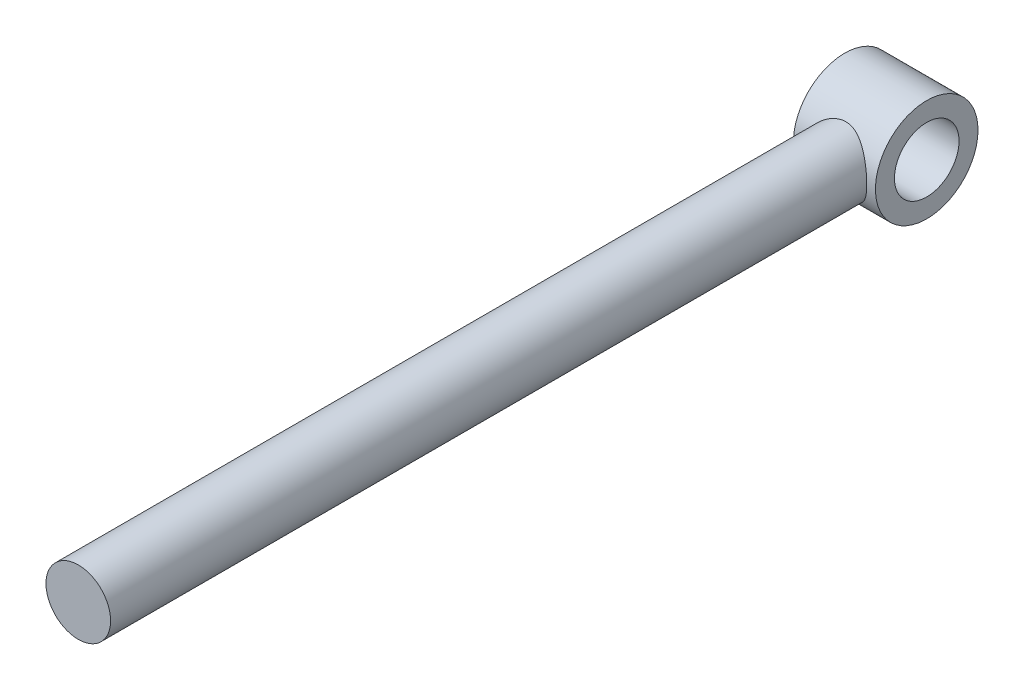
ISO-10303-21;
HEADER;
FILE_DESCRIPTION(('STEP AP214'),'2;1');
FILE_NAME('part.step','',(''),(''),'','','');
FILE_SCHEMA(('AUTOMOTIVE_DESIGN { 1 0 10303 214 1 1 1 1 }'));
ENDSEC;
DATA;
#1=APPLICATION_CONTEXT('core data for automotive mechanical design processes');
#2=APPLICATION_PROTOCOL_DEFINITION('international standard','automotive_design',2000,#1);
#3=PRODUCT_CONTEXT('',#1,'mechanical');
#4=PRODUCT('Part','Part','',(#3));
#5=PRODUCT_RELATED_PRODUCT_CATEGORY('part','',(#4));
#6=PRODUCT_DEFINITION_FORMATION('','',#4);
#7=PRODUCT_DEFINITION_CONTEXT('part definition',#1,'design');
#8=PRODUCT_DEFINITION('design','',#6,#7);
#9=PRODUCT_DEFINITION_SHAPE('','',#8);
#10=(LENGTH_UNIT() NAMED_UNIT(*) SI_UNIT(.MILLI.,.METRE.));
#11=(NAMED_UNIT(*) PLANE_ANGLE_UNIT() SI_UNIT($,.RADIAN.));
#12=(NAMED_UNIT(*) SI_UNIT($,.STERADIAN.) SOLID_ANGLE_UNIT());
#13=UNCERTAINTY_MEASURE_WITH_UNIT(LENGTH_MEASURE(1.E-05),#10,'distance_accuracy_value','');
#14=(GEOMETRIC_REPRESENTATION_CONTEXT(3) GLOBAL_UNCERTAINTY_ASSIGNED_CONTEXT((#13)) GLOBAL_UNIT_ASSIGNED_CONTEXT((#10,
#11,#12)) REPRESENTATION_CONTEXT('',''));
#15=CARTESIAN_POINT('',(0.,0.,0.));
#16=DIRECTION('',(0.,0.,1.));
#17=DIRECTION('',(1.,0.,0.));
#18=AXIS2_PLACEMENT_3D('',#15,#16,#17);
#19=CARTESIAN_POINT('',(0.,0.,100.));
#20=DIRECTION('',(0.,0.,-1.));
#21=DIRECTION('',(-1.,0.,0.));
#22=AXIS2_PLACEMENT_3D('',#19,#20,#21);
#23=CYLINDRICAL_SURFACE('',#22,4.);
#24=CARTESIAN_POINT('',(0.,0.,100.));
#25=DIRECTION('',(0.,0.,1.));
#26=DIRECTION('',(1.,0.,0.));
#27=AXIS2_PLACEMENT_3D('',#24,#25,#26);
#28=CIRCLE('',#27,4.);
#29=CARTESIAN_POINT('',(4.,0.,100.));
#30=VERTEX_POINT('',#29);
#31=EDGE_CURVE('E50',#30,#30,#28,.T.);
#32=ORIENTED_EDGE('',*,*,#31,.F.);
#33=EDGE_LOOP('',(#32));
#34=FACE_BOUND('',#33,.T.);
#35=CARTESIAN_POINT('',(-4.,0.,6.35));
#36=CARTESIAN_POINT('',(-3.99999995510916,0.101525412716496,6.34999994649463));
#37=CARTESIAN_POINT('',(-3.99612958259243,0.203052102008012,6.34755977597351));
#38=CARTESIAN_POINT('',(-3.98070422165806,0.405324806451029,6.33786010438948));
#39=CARTESIAN_POINT('',(-3.96914612515864,0.506070489175679,6.33059865412608));
#40=CARTESIAN_POINT('',(-3.93848647502557,0.706095620228219,6.31142070021645));
#41=CARTESIAN_POINT('',(-3.91937505839162,0.805372974690674,6.29949811035243));
#42=CARTESIAN_POINT('',(-3.87387512370748,1.00162774872955,6.27129137980277));
#43=CARTESIAN_POINT('',(-3.84748352487038,1.09860417570234,6.25500539272306));
#44=CARTESIAN_POINT('',(-3.75817568956162,1.38406576421983,6.20033339384378));
#45=CARTESIAN_POINT('',(-3.68493378434539,1.56830710528591,6.15600916963194));
#46=CARTESIAN_POINT('',(-3.51394264954222,1.92113096856517,6.05520788310711));
#47=CARTESIAN_POINT('',(-3.41619551166135,2.08971482558016,5.99873185810008));
#48=CARTESIAN_POINT('',(-3.19027126669194,2.4219186333453,5.87288751282639));
#49=CARTESIAN_POINT('',(-3.06027804550871,2.58404668259597,5.80284736031166));
#50=CARTESIAN_POINT('',(-2.77774786064604,2.88563829049015,5.65893899758031));
#51=CARTESIAN_POINT('',(-2.62518033890793,3.0250705808046,5.58506568796695));
#52=CARTESIAN_POINT('',(-2.27719152870427,3.29692058790655,5.42959821580262));
#53=CARTESIAN_POINT('',(-2.07876190273039,3.42571411240611,5.34834565069208));
#54=CARTESIAN_POINT('',(-1.65833150058393,3.64776689678471,5.19944398433001));
#55=CARTESIAN_POINT('',(-1.43637158578104,3.74108650671107,5.13177187277257));
#56=CARTESIAN_POINT('',(-1.03438789012269,3.86808008233265,5.0363712932397));
#57=CARTESIAN_POINT('',(-0.858671729551468,3.91098377546496,5.00281938829134));
#58=CARTESIAN_POINT('',(-0.500677077248823,3.97268105118094,4.95397872891132));
#59=CARTESIAN_POINT('',(-0.318408478426899,3.99150953064455,4.9386635426839));
#60=CARTESIAN_POINT('',(0.0480847681941263,4.00392199667946,4.92860937287735));
#61=CARTESIAN_POINT('',(0.232313430267999,3.99743605742564,4.9339273839815));
#62=CARTESIAN_POINT('',(0.59655901942314,3.95950874214796,4.96440729348615));
#63=CARTESIAN_POINT('',(0.77657241408238,3.92804715623093,4.98958526214087));
#64=CARTESIAN_POINT('',(1.12328962649946,3.84308803319744,5.05528719298411));
#65=CARTESIAN_POINT('',(1.29021384836459,3.79016200819667,5.0954111010467));
#66=CARTESIAN_POINT('',(1.61313595836598,3.66440437266902,5.18658481731349));
#67=CARTESIAN_POINT('',(1.76912997909833,3.59156576076106,5.23763846710626));
#68=CARTESIAN_POINT('',(2.09712857802723,3.41222507038465,5.35656962666191));
#69=CARTESIAN_POINT('',(2.26658559985018,3.30196228086894,5.42580308422615));
#70=CARTESIAN_POINT('',(2.58644738345785,3.05791751612207,5.56700952737496));
#71=CARTESIAN_POINT('',(2.73683206821967,2.92411110492092,5.63898529780289));
#72=CARTESIAN_POINT('',(3.04053297214451,2.60971152773762,5.79200405409259));
#73=CARTESIAN_POINT('',(3.1899811359739,2.42503109875057,5.87250187506191));
#74=CARTESIAN_POINT('',(3.38910596054729,2.12796074140342,5.98377391103042));
#75=CARTESIAN_POINT('',(3.45133217921882,2.0255371505254,6.01930148923467));
#76=CARTESIAN_POINT('',(3.56679840832307,1.81449450089058,6.08624091730871));
#77=CARTESIAN_POINT('',(3.62004395722974,1.70587931626931,6.1176553011347));
#78=CARTESIAN_POINT('',(3.71438352299744,1.48883690132733,6.17396062926589));
#79=CARTESIAN_POINT('',(3.7559600219556,1.38068461874604,6.19910317520335));
#80=CARTESIAN_POINT('',(3.82979758337014,1.16023678192954,6.24411660299021));
#81=CARTESIAN_POINT('',(3.86206405770179,1.04794367772734,6.26399054690622));
#82=CARTESIAN_POINT('',(3.9167504180572,0.820222632801572,6.29785464590667));
#83=CARTESIAN_POINT('',(3.93917947279612,0.704797718025981,6.31185027920207));
#84=CARTESIAN_POINT('',(3.97381694690561,0.471844820832591,6.33352485714062));
#85=CARTESIAN_POINT('',(3.98602717897341,0.354317215186589,6.34120492208605));
#86=CARTESIAN_POINT('',(3.99893732688113,0.136252614099275,6.34932920661913));
#87=CARTESIAN_POINT('',(4.00109822816221,0.0358329410043498,6.35069176357529));
#88=CARTESIAN_POINT('',(3.99786104497834,-0.164869939274281,6.34865268616315));
#89=CARTESIAN_POINT('',(3.99246065522575,-0.26515309550491,6.34524959884439));
#90=CARTESIAN_POINT('',(3.97417529709881,-0.464717858382404,6.33376015739839));
#91=CARTESIAN_POINT('',(3.96129383736066,-0.563999912356056,6.32567599870787));
#92=CARTESIAN_POINT('',(3.9282364760876,-0.760881760245827,6.30502820062554));
#93=CARTESIAN_POINT('',(3.90805776773004,-0.858480891685952,6.29246283760356));
#94=CARTESIAN_POINT('',(3.83896871234142,-1.13945135672983,6.24970974594446));
#95=CARTESIAN_POINT('',(3.78064815155345,-1.31976085247647,6.2139078302031));
#96=CARTESIAN_POINT('',(3.64060599709803,-1.66771080334263,6.12971453707587));
#97=CARTESIAN_POINT('',(3.55888059729935,-1.83534919225822,6.08132111215641));
#98=CARTESIAN_POINT('',(3.36534756588072,-2.17157025277827,5.9700221692317));
#99=CARTESIAN_POINT('',(3.25134790836299,-2.33856846018365,5.90614900447937));
#100=CARTESIAN_POINT('',(3.00102763691263,-2.65220304255513,5.77212997676191));
#101=CARTESIAN_POINT('',(2.86468262207902,-2.79881683078566,5.70197729506395));
#102=CARTESIAN_POINT('',(2.55032094034776,-3.09003818954702,5.55021735366289));
#103=CARTESIAN_POINT('',(2.36912359536784,-3.23114505842746,5.46844987378671));
#104=CARTESIAN_POINT('',(1.98291484526382,-3.48151175502982,5.31256299570485));
#105=CARTESIAN_POINT('',(1.77791808270074,-3.59079102093571,5.23843894734489));
#106=CARTESIAN_POINT('',(1.39179653022624,-3.75463434457298,5.12183333040485));
#107=CARTESIAN_POINT('',(1.21452658557886,-3.81584386895346,5.07597771831806));
#108=CARTESIAN_POINT('',(0.849886192826908,-3.91320524474266,5.0013135676337));
#109=CARTESIAN_POINT('',(0.662532300381574,-3.949396894314,4.97247796452169));
#110=CARTESIAN_POINT('',(0.281248408973819,-3.99473796859828,4.93614061313469));
#111=CARTESIAN_POINT('',(0.0872852251864674,-4.00372081979568,4.92877028679677));
#112=CARTESIAN_POINT('',(-0.299427975720518,-3.9934659016834,4.93708013445794));
#113=CARTESIAN_POINT('',(-0.492177651445321,-3.97422051857851,4.95276652737972));
#114=CARTESIAN_POINT('',(-0.853516851620247,-3.91180327619831,5.00216482253445));
#115=CARTESIAN_POINT('',(-1.02274544716338,-3.8708700528947,5.03418112739215));
#116=CARTESIAN_POINT('',(-1.35176926129039,-3.76861159995435,5.11117840587276));
#117=CARTESIAN_POINT('',(-1.51156036254253,-3.70727754623258,5.15616498847881));
#118=CARTESIAN_POINT('',(-1.84172373413128,-3.55605992638277,5.26180363872406));
#119=CARTESIAN_POINT('',(-2.01037530319693,-3.46335868582019,5.32377319530916));
#120=CARTESIAN_POINT('',(-2.33135341758181,-3.25597102561732,5.45308201663022));
#121=CARTESIAN_POINT('',(-2.4836668343943,-3.14126712907485,5.52042552494237));
#122=CARTESIAN_POINT('',(-2.79992149062524,-2.86583039278992,5.66910634113435));
#123=CARTESIAN_POINT('',(-2.95985144129561,-2.70048193488344,5.75048386864077));
#124=CARTESIAN_POINT('',(-3.25068407327979,-2.34226022265158,5.90544815770627));
#125=CARTESIAN_POINT('',(-3.38156707494452,-2.14936845193938,5.97902961980739));
#126=CARTESIAN_POINT('',(-3.55294573137998,-1.84135851726739,6.07813769658613));
#127=CARTESIAN_POINT('',(-3.60612176506956,-1.73498188703833,6.10942738240534));
#128=CARTESIAN_POINT('',(-3.70316351225191,-1.51684048815052,6.16720290754029));
#129=CARTESIAN_POINT('',(-3.74703457857721,-1.4050788629588,6.19369150747551));
#130=CARTESIAN_POINT('',(-3.82471327870366,-1.17729106915278,6.24099246908899));
#131=CARTESIAN_POINT('',(-3.85854743973692,-1.06127706907701,6.26181978094481));
#132=CARTESIAN_POINT('',(-3.91569724648019,-0.825815822296969,6.29719612178767));
#133=CARTESIAN_POINT('',(-3.9390204420846,-0.706371105644121,6.31174965682222));
#134=CARTESIAN_POINT('',(-3.97118217406829,-0.489151328747127,6.3318770395755));
#135=CARTESIAN_POINT('',(-3.98197503867959,-0.391771947989324,6.33865875488549));
#136=CARTESIAN_POINT('',(-3.99638418568685,-0.196262138439821,6.34772039415867));
#137=CARTESIAN_POINT('',(-4.00000004339025,-0.0981316655478515,6.35000005171681));
#138=CARTESIAN_POINT('',(-4.,0.,6.35));
#139=B_SPLINE_CURVE_WITH_KNOTS('',3,(#35,#36,#37,#38,#39,#40,#41,#42,#43,#44,#45,#46,#47,#48,
#49,#50,#51,#52,#53,#54,#55,#56,#57,#58,#59,#60,#61,#62,#63,#64,#65,#66,#67,#68,#69,#70,#71,#72,
#73,#74,#75,#76,#77,#78,#79,#80,#81,#82,#83,#84,#85,#86,#87,#88,#89,#90,#91,#92,#93,#94,#95,#96,
#97,#98,#99,#100,#101,#102,#103,#104,#105,#106,#107,#108,#109,#110,#111,#112,#113,#114,#115,
#116,#117,#118,#119,#120,#121,#122,#123,#124,#125,#126,#127,#128,#129,#130,#131,#132,#133,#134,
#135,#136,#137,#138),.UNSPECIFIED.,.T.,.F.,(4,2,2,2,2,2,2,2,2,2,2,2,2,2,2,2,2,2,2,2,2,2,2,2,2,2,
2,2,2,2,2,2,2,2,2,2,2,2,2,2,2,2,2,2,2,2,2,2,2,2,2,4),(0.,0.304475673779387,0.609074519381019,
0.914072426213339,1.21919959888141,1.82576648880515,2.43228162129674,3.08761822774918,
3.74385019731851,4.49065418696132,5.23618192787149,5.78579463397553,6.33460977324068,
6.8849419718479,7.43571994493679,7.97270631084696,8.50988172765307,9.14859942004794,
9.78798399184218,10.5363328604409,10.910897280737,11.2852298518074,11.6404019773896,
11.9953672251476,12.3500009299399,12.7045717136015,13.0055418657118,13.3066037976346,
13.607524644829,13.9085613619127,14.4844975024597,15.0605273558711,15.6942045253128,
16.3285783316023,17.0567325609522,17.7844411450742,18.361365772859,18.9373705100111,
19.5168945189842,20.0965748674778,20.6255815719624,21.1548173888653,21.759222931282,
22.3641105613076,23.0929289664624,23.8222396573602,24.1906952003272,24.5589382049343,
24.9261991014171,25.2931957769097,25.5874761575619,25.8817739514572),.UNSPECIFIED.);
#140=CARTESIAN_POINT('',(-4.,0.,6.35));
#141=VERTEX_POINT('',#140);
#142=EDGE_CURVE('E10',#141,#141,#139,.T.);
#143=ORIENTED_EDGE('',*,*,#142,.F.);
#144=EDGE_LOOP('',(#143));
#145=FACE_BOUND('',#144,.T.);
#146=ADVANCED_FACE('F39',(#34,#145),#23,.T.);
#147=CARTESIAN_POINT('',(0.,0.,100.));
#148=DIRECTION('',(0.,0.,1.));
#149=DIRECTION('',(1.,0.,0.));
#150=AXIS2_PLACEMENT_3D('',#147,#148,#149);
#151=PLANE('',#150);
#152=ORIENTED_EDGE('',*,*,#31,.T.);
#153=EDGE_LOOP('',(#152));
#154=FACE_BOUND('',#153,.T.);
#155=ADVANCED_FACE('F87',(#154),#151,.T.);
#156=CARTESIAN_POINT('',(5.08,0.,0.));
#157=DIRECTION('',(-1.,0.,0.));
#158=DIRECTION('',(0.,0.,1.));
#159=AXIS2_PLACEMENT_3D('',#156,#157,#158);
#160=CYLINDRICAL_SURFACE('',#159,6.35);
#161=CARTESIAN_POINT('',(-5.08,0.,0.));
#162=DIRECTION('',(1.,0.,0.));
#163=DIRECTION('',(0.,0.,-1.));
#164=AXIS2_PLACEMENT_3D('',#161,#162,#163);
#165=CIRCLE('',#164,6.35);
#166=CARTESIAN_POINT('',(-5.08,0.,-6.35));
#167=VERTEX_POINT('',#166);
#168=EDGE_CURVE('E58',#167,#167,#165,.T.);
#169=ORIENTED_EDGE('',*,*,#168,.T.);
#170=EDGE_LOOP('',(#169));
#171=FACE_BOUND('',#170,.T.);
#172=CARTESIAN_POINT('',(5.08,0.,0.));
#173=DIRECTION('',(1.,0.,0.));
#174=DIRECTION('',(0.,0.,-1.));
#175=AXIS2_PLACEMENT_3D('',#172,#173,#174);
#176=CIRCLE('',#175,6.35);
#177=CARTESIAN_POINT('',(5.08,0.,-6.35));
#178=VERTEX_POINT('',#177);
#179=EDGE_CURVE('E54',#178,#178,#176,.T.);
#180=ORIENTED_EDGE('',*,*,#179,.F.);
#181=EDGE_LOOP('',(#180));
#182=FACE_BOUND('',#181,.T.);
#183=ORIENTED_EDGE('',*,*,#142,.T.);
#184=EDGE_LOOP('',(#183));
#185=FACE_BOUND('',#184,.T.);
#186=ADVANCED_FACE('F82',(#171,#182,#185),#160,.T.);
#187=CARTESIAN_POINT('',(5.08,0.,0.));
#188=DIRECTION('',(1.,0.,0.));
#189=DIRECTION('',(0.,0.,-1.));
#190=AXIS2_PLACEMENT_3D('',#187,#188,#189);
#191=PLANE('',#190);
#192=CARTESIAN_POINT('',(5.08,0.,0.));
#193=DIRECTION('',(1.,0.,0.));
#194=DIRECTION('',(0.,0.,-1.));
#195=AXIS2_PLACEMENT_3D('',#192,#193,#194);
#196=CIRCLE('',#195,4.);
#197=CARTESIAN_POINT('',(5.08,0.,-4.));
#198=VERTEX_POINT('',#197);
#199=EDGE_CURVE('E64',#198,#198,#196,.T.);
#200=ORIENTED_EDGE('',*,*,#199,.F.);
#201=EDGE_LOOP('',(#200));
#202=FACE_BOUND('',#201,.T.);
#203=ORIENTED_EDGE('',*,*,#179,.T.);
#204=EDGE_LOOP('',(#203));
#205=FACE_BOUND('',#204,.T.);
#206=ADVANCED_FACE('F79',(#202,#205),#191,.T.);
#207=CARTESIAN_POINT('',(-5.08,0.,0.));
#208=DIRECTION('',(1.,0.,0.));
#209=DIRECTION('',(0.,0.,-1.));
#210=AXIS2_PLACEMENT_3D('',#207,#208,#209);
#211=PLANE('',#210);
#212=CARTESIAN_POINT('',(-5.08,0.,0.));
#213=DIRECTION('',(1.,0.,0.));
#214=DIRECTION('',(0.,0.,-1.));
#215=AXIS2_PLACEMENT_3D('',#212,#213,#214);
#216=CIRCLE('',#215,4.);
#217=CARTESIAN_POINT('',(-5.08,0.,-4.));
#218=VERTEX_POINT('',#217);
#219=EDGE_CURVE('E62',#218,#218,#216,.T.);
#220=ORIENTED_EDGE('',*,*,#219,.T.);
#221=EDGE_LOOP('',(#220));
#222=FACE_BOUND('',#221,.T.);
#223=ORIENTED_EDGE('',*,*,#168,.F.);
#224=EDGE_LOOP('',(#223));
#225=FACE_BOUND('',#224,.T.);
#226=ADVANCED_FACE('F70',(#222,#225),#211,.F.);
#227=CARTESIAN_POINT('',(-5.08,0.,0.));
#228=DIRECTION('',(1.,0.,0.));
#229=DIRECTION('',(0.,0.,-1.));
#230=AXIS2_PLACEMENT_3D('',#227,#228,#229);
#231=CYLINDRICAL_SURFACE('',#230,4.);
#232=ORIENTED_EDGE('',*,*,#219,.F.);
#233=EDGE_LOOP('',(#232));
#234=FACE_BOUND('',#233,.T.);
#235=ORIENTED_EDGE('',*,*,#199,.T.);
#236=EDGE_LOOP('',(#235));
#237=FACE_BOUND('',#236,.T.);
#238=ADVANCED_FACE('F73',(#234,#237),#231,.F.);
#239=CLOSED_SHELL('',(#146,#155,#186,#206,#226,#238));
#240=MANIFOLD_SOLID_BREP('B2',#239);
#241=ADVANCED_BREP_SHAPE_REPRESENTATION('',(#18,#240),#14);
#242=SHAPE_DEFINITION_REPRESENTATION(#9,#241);
ENDSEC;
END-ISO-10303-21;
